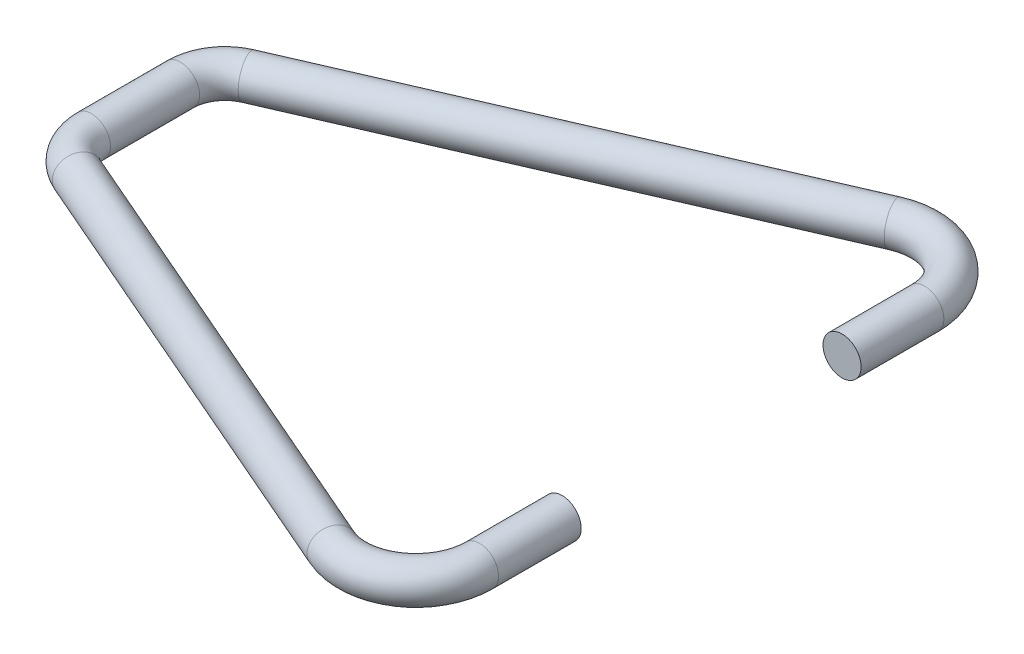
ISO-10303-21;
HEADER;
FILE_DESCRIPTION(('STEP AP214'),'2;1');
FILE_NAME('part.step','',(''),(''),'','','');
FILE_SCHEMA(('AUTOMOTIVE_DESIGN { 1 0 10303 214 1 1 1 1 }'));
ENDSEC;
DATA;
#1=APPLICATION_CONTEXT('core data for automotive mechanical design processes');
#2=APPLICATION_PROTOCOL_DEFINITION('international standard','automotive_design',2000,#1);
#3=PRODUCT_CONTEXT('',#1,'mechanical');
#4=PRODUCT('Part','Part','',(#3));
#5=PRODUCT_RELATED_PRODUCT_CATEGORY('part','',(#4));
#6=PRODUCT_DEFINITION_FORMATION('','',#4);
#7=PRODUCT_DEFINITION_CONTEXT('part definition',#1,'design');
#8=PRODUCT_DEFINITION('design','',#6,#7);
#9=PRODUCT_DEFINITION_SHAPE('','',#8);
#10=(LENGTH_UNIT() NAMED_UNIT(*) SI_UNIT(.MILLI.,.METRE.));
#11=(NAMED_UNIT(*) PLANE_ANGLE_UNIT() SI_UNIT($,.RADIAN.));
#12=(NAMED_UNIT(*) SI_UNIT($,.STERADIAN.) SOLID_ANGLE_UNIT());
#13=UNCERTAINTY_MEASURE_WITH_UNIT(LENGTH_MEASURE(1.E-05),#10,'distance_accuracy_value','');
#14=(GEOMETRIC_REPRESENTATION_CONTEXT(3) GLOBAL_UNCERTAINTY_ASSIGNED_CONTEXT((#13)) GLOBAL_UNIT_ASSIGNED_CONTEXT((#10,
#11,#12)) REPRESENTATION_CONTEXT('',''));
#15=CARTESIAN_POINT('',(0.,0.,0.));
#16=DIRECTION('',(0.,0.,1.));
#17=DIRECTION('',(1.,0.,0.));
#18=AXIS2_PLACEMENT_3D('',#15,#16,#17);
#19=CARTESIAN_POINT('',(89.,0.,-22.));
#20=DIRECTION('',(0.,0.,-1.));
#21=DIRECTION('',(-1.,0.,0.));
#22=AXIS2_PLACEMENT_3D('',#19,#20,#21);
#23=PLANE('',#22);
#24=CARTESIAN_POINT('',(89.,0.,-22.));
#25=DIRECTION('',(0.,0.,-1.));
#26=DIRECTION('',(-1.,0.,0.));
#27=AXIS2_PLACEMENT_3D('',#24,#25,#26);
#28=CIRCLE('',#27,3.);
#29=CARTESIAN_POINT('',(86.,0.,-22.));
#30=VERTEX_POINT('',#29);
#31=EDGE_CURVE('E10',#30,#30,#28,.T.);
#32=ORIENTED_EDGE('',*,*,#31,.F.);
#33=EDGE_LOOP('',(#32));
#34=FACE_BOUND('',#33,.T.);
#35=ADVANCED_FACE('F41',(#34),#23,.F.);
#36=CARTESIAN_POINT('',(0.,0.,0.));
#37=DIRECTION('',(0.,0.,-1.));
#38=DIRECTION('',(-1.,0.,0.));
#39=AXIS2_PLACEMENT_3D('',#36,#37,#38);
#40=CYLINDRICAL_SURFACE('',#39,3.);
#41=CARTESIAN_POINT('',(0.,0.,-7.));
#42=DIRECTION('',(0.,0.,1.));
#43=DIRECTION('',(1.,0.,0.));
#44=AXIS2_PLACEMENT_3D('',#41,#42,#43);
#45=CIRCLE('',#44,3.);
#46=CARTESIAN_POINT('',(-3.,0.,-7.));
#47=VERTEX_POINT('',#46);
#48=EDGE_CURVE('E64',#47,#47,#45,.T.);
#49=ORIENTED_EDGE('',*,*,#48,.T.);
#50=EDGE_LOOP('',(#49));
#51=FACE_BOUND('',#50,.T.);
#52=CARTESIAN_POINT('',(0.,0.,7.));
#53=DIRECTION('',(0.,0.,1.));
#54=DIRECTION('',(1.,0.,0.));
#55=AXIS2_PLACEMENT_3D('',#52,#53,#54);
#56=CIRCLE('',#55,3.);
#57=CARTESIAN_POINT('',(-3.,0.,7.));
#58=VERTEX_POINT('',#57);
#59=EDGE_CURVE('E84',#58,#58,#56,.F.);
#60=ORIENTED_EDGE('',*,*,#59,.T.);
#61=EDGE_LOOP('',(#60));
#62=FACE_BOUND('',#61,.T.);
#63=ADVANCED_FACE('F89',(#51,#62),#40,.T.);
#64=CARTESIAN_POINT('',(7.,0.,-7.));
#65=DIRECTION('',(0.,-1.,0.));
#66=DIRECTION('',(0.,0.,-1.));
#67=AXIS2_PLACEMENT_3D('',#64,#65,#66);
#68=TOROIDAL_SURFACE('',#67,7.,3.);
#69=CARTESIAN_POINT('',(4.21143873304606,0.,-13.4205861150244));
#70=DIRECTION('',(-0.91722658786063,0.,0.398365895279134));
#71=DIRECTION('',(0.398365895279134,0.,0.91722658786063));
#72=AXIS2_PLACEMENT_3D('',#69,#70,#71);
#73=CIRCLE('',#72,3.);
#74=CARTESIAN_POINT('',(3.01634104720865,0.,-16.1722658786063));
#75=VERTEX_POINT('',#74);
#76=EDGE_CURVE('E58',#75,#75,#73,.T.);
#77=CARTESIAN_POINT('',(7.,0.,-7.));
#78=DIRECTION('',(0.,-1.,0.));
#79=DIRECTION('',(0.,0.,-1.));
#80=AXIS2_PLACEMENT_3D('',#77,#78,#79);
#81=CIRCLE('',#80,10.);
#82=EDGE_CURVE('',#47,#75,#81,.T.);
#83=ORIENTED_EDGE('',*,*,#48,.F.);
#84=ORIENTED_EDGE('',*,*,#76,.T.);
#85=ORIENTED_EDGE('',*,*,#82,.T.);
#86=ORIENTED_EDGE('',*,*,#82,.F.);
#87=EDGE_LOOP('',(#83,#85,#84,#86));
#88=FACE_BOUND('',#87,.T.);
#89=ADVANCED_FACE('F118',(#88),#68,.T.);
#90=CARTESIAN_POINT('',(4.21143873304606,0.,-13.4205861150244));
#91=DIRECTION('',(0.91722658786063,0.,-0.398365895279134));
#92=DIRECTION('',(-0.398365895279134,0.,-0.91722658786063));
#93=AXIS2_PLACEMENT_3D('',#90,#91,#92);
#94=CYLINDRICAL_SURFACE('',#93,3.);
#95=CARTESIAN_POINT('',(75.0163410472087,0.,-44.1722658786063));
#96=DIRECTION('',(-0.91722658786063,0.,0.398365895279134));
#97=DIRECTION('',(0.398365895279134,0.,0.91722658786063));
#98=AXIS2_PLACEMENT_3D('',#95,#96,#97);
#99=CIRCLE('',#98,3.);
#100=CARTESIAN_POINT('',(73.8212433613712,0.,-46.9239456421882));
#101=VERTEX_POINT('',#100);
#102=EDGE_CURVE('E53',#101,#101,#99,.T.);
#103=ORIENTED_EDGE('',*,*,#102,.T.);
#104=EDGE_LOOP('',(#103));
#105=FACE_BOUND('',#104,.T.);
#106=ORIENTED_EDGE('',*,*,#76,.F.);
#107=EDGE_LOOP('',(#106));
#108=FACE_BOUND('',#107,.T.);
#109=ADVANCED_FACE('F112',(#105,#108),#94,.T.);
#110=CARTESIAN_POINT('',(79.,0.,-35.));
#111=DIRECTION('',(0.,-1.,0.));
#112=DIRECTION('',(0.,0.,-1.));
#113=AXIS2_PLACEMENT_3D('',#110,#111,#112);
#114=TOROIDAL_SURFACE('',#113,10.,3.);
#115=CARTESIAN_POINT('',(89.,0.,-35.));
#116=DIRECTION('',(0.,0.,-1.));
#117=DIRECTION('',(-1.,0.,0.));
#118=AXIS2_PLACEMENT_3D('',#115,#116,#117);
#119=CIRCLE('',#118,3.);
#120=CARTESIAN_POINT('',(92.,0.,-35.));
#121=VERTEX_POINT('',#120);
#122=EDGE_CURVE('E48',#121,#121,#119,.T.);
#123=CARTESIAN_POINT('',(79.,0.,-35.));
#124=DIRECTION('',(0.,-1.,0.));
#125=DIRECTION('',(0.,0.,-1.));
#126=AXIS2_PLACEMENT_3D('',#123,#124,#125);
#127=CIRCLE('',#126,13.);
#128=EDGE_CURVE('',#101,#121,#127,.T.);
#129=ORIENTED_EDGE('',*,*,#102,.F.);
#130=ORIENTED_EDGE('',*,*,#122,.T.);
#131=ORIENTED_EDGE('',*,*,#128,.T.);
#132=ORIENTED_EDGE('',*,*,#128,.F.);
#133=EDGE_LOOP('',(#129,#131,#130,#132));
#134=FACE_BOUND('',#133,.T.);
#135=ADVANCED_FACE('F108',(#134),#114,.T.);
#136=CARTESIAN_POINT('',(89.,0.,-35.));
#137=DIRECTION('',(0.,0.,1.));
#138=DIRECTION('',(1.,0.,0.));
#139=AXIS2_PLACEMENT_3D('',#136,#137,#138);
#140=CYLINDRICAL_SURFACE('',#139,3.);
#141=ORIENTED_EDGE('',*,*,#31,.T.);
#142=EDGE_LOOP('',(#141));
#143=FACE_BOUND('',#142,.T.);
#144=ORIENTED_EDGE('',*,*,#122,.F.);
#145=EDGE_LOOP('',(#144));
#146=FACE_BOUND('',#145,.T.);
#147=ADVANCED_FACE('F104',(#143,#146),#140,.T.);
#148=CARTESIAN_POINT('',(89.,0.,22.));
#149=DIRECTION('',(0.,0.,1.));
#150=DIRECTION('',(-1.,0.,0.));
#151=AXIS2_PLACEMENT_3D('',#148,#149,#150);
#152=PLANE('',#151);
#153=CARTESIAN_POINT('',(89.,0.,22.));
#154=DIRECTION('',(0.,0.,-1.));
#155=DIRECTION('',(-1.,0.,0.));
#156=AXIS2_PLACEMENT_3D('',#153,#154,#155);
#157=CIRCLE('',#156,3.);
#158=CARTESIAN_POINT('',(86.,0.,22.));
#159=VERTEX_POINT('',#158);
#160=EDGE_CURVE('E68',#159,#159,#157,.F.);
#161=ORIENTED_EDGE('',*,*,#160,.F.);
#162=EDGE_LOOP('',(#161));
#163=FACE_BOUND('',#162,.T.);
#164=ADVANCED_FACE('F94',(#163),#152,.F.);
#165=CARTESIAN_POINT('',(7.,0.,7.));
#166=DIRECTION('',(0.,1.,0.));
#167=DIRECTION('',(0.,0.,1.));
#168=AXIS2_PLACEMENT_3D('',#165,#166,#167);
#169=TOROIDAL_SURFACE('',#168,7.,3.);
#170=CARTESIAN_POINT('',(4.21143873304606,0.,13.4205861150244));
#171=DIRECTION('',(0.91722658786063,0.,0.398365895279134));
#172=DIRECTION('',(0.398365895279134,0.,-0.91722658786063));
#173=AXIS2_PLACEMENT_3D('',#170,#171,#172);
#174=CIRCLE('',#173,3.);
#175=CARTESIAN_POINT('',(3.01634104720865,0.,16.1722658786063));
#176=VERTEX_POINT('',#175);
#177=EDGE_CURVE('E80',#176,#176,#174,.F.);
#178=CARTESIAN_POINT('',(7.,0.,7.));
#179=DIRECTION('',(0.,1.,0.));
#180=DIRECTION('',(0.,0.,1.));
#181=AXIS2_PLACEMENT_3D('',#178,#179,#180);
#182=CIRCLE('',#181,10.);
#183=EDGE_CURVE('',#58,#176,#182,.T.);
#184=ORIENTED_EDGE('',*,*,#59,.F.);
#185=ORIENTED_EDGE('',*,*,#177,.T.);
#186=ORIENTED_EDGE('',*,*,#183,.T.);
#187=ORIENTED_EDGE('',*,*,#183,.F.);
#188=EDGE_LOOP('',(#184,#186,#185,#187));
#189=FACE_BOUND('',#188,.T.);
#190=ADVANCED_FACE('F91',(#189),#169,.T.);
#191=CARTESIAN_POINT('',(4.21143873304606,0.,13.4205861150244));
#192=DIRECTION('',(0.91722658786063,0.,0.398365895279134));
#193=DIRECTION('',(0.398365895279134,0.,-0.91722658786063));
#194=AXIS2_PLACEMENT_3D('',#191,#192,#193);
#195=CYLINDRICAL_SURFACE('',#194,3.);
#196=CARTESIAN_POINT('',(75.0163410472087,0.,44.1722658786063));
#197=DIRECTION('',(0.91722658786063,0.,0.398365895279134));
#198=DIRECTION('',(0.398365895279134,0.,-0.91722658786063));
#199=AXIS2_PLACEMENT_3D('',#196,#197,#198);
#200=CIRCLE('',#199,3.);
#201=CARTESIAN_POINT('',(73.8212433613712,0.,46.9239456421882));
#202=VERTEX_POINT('',#201);
#203=EDGE_CURVE('E76',#202,#202,#200,.F.);
#204=ORIENTED_EDGE('',*,*,#203,.T.);
#205=EDGE_LOOP('',(#204));
#206=FACE_BOUND('',#205,.T.);
#207=ORIENTED_EDGE('',*,*,#177,.F.);
#208=EDGE_LOOP('',(#207));
#209=FACE_BOUND('',#208,.T.);
#210=ADVANCED_FACE('F93',(#206,#209),#195,.T.);
#211=CARTESIAN_POINT('',(79.,0.,35.));
#212=DIRECTION('',(0.,1.,0.));
#213=DIRECTION('',(0.,0.,1.));
#214=AXIS2_PLACEMENT_3D('',#211,#212,#213);
#215=TOROIDAL_SURFACE('',#214,10.,3.);
#216=CARTESIAN_POINT('',(89.,0.,35.));
#217=DIRECTION('',(0.,0.,-1.));
#218=DIRECTION('',(-1.,0.,0.));
#219=AXIS2_PLACEMENT_3D('',#216,#217,#218);
#220=CIRCLE('',#219,3.);
#221=CARTESIAN_POINT('',(92.,0.,35.));
#222=VERTEX_POINT('',#221);
#223=EDGE_CURVE('E72',#222,#222,#220,.F.);
#224=CARTESIAN_POINT('',(79.,0.,35.));
#225=DIRECTION('',(0.,1.,0.));
#226=DIRECTION('',(0.,0.,1.));
#227=AXIS2_PLACEMENT_3D('',#224,#225,#226);
#228=CIRCLE('',#227,13.);
#229=EDGE_CURVE('',#202,#222,#228,.T.);
#230=ORIENTED_EDGE('',*,*,#203,.F.);
#231=ORIENTED_EDGE('',*,*,#223,.T.);
#232=ORIENTED_EDGE('',*,*,#229,.T.);
#233=ORIENTED_EDGE('',*,*,#229,.F.);
#234=EDGE_LOOP('',(#230,#232,#231,#233));
#235=FACE_BOUND('',#234,.T.);
#236=ADVANCED_FACE('F101',(#235),#215,.T.);
#237=CARTESIAN_POINT('',(89.,0.,35.));
#238=DIRECTION('',(0.,0.,-1.));
#239=DIRECTION('',(-1.,0.,0.));
#240=AXIS2_PLACEMENT_3D('',#237,#238,#239);
#241=CYLINDRICAL_SURFACE('',#240,3.);
#242=ORIENTED_EDGE('',*,*,#160,.T.);
#243=EDGE_LOOP('',(#242));
#244=FACE_BOUND('',#243,.T.);
#245=ORIENTED_EDGE('',*,*,#223,.F.);
#246=EDGE_LOOP('',(#245));
#247=FACE_BOUND('',#246,.T.);
#248=ADVANCED_FACE('F126',(#244,#247),#241,.T.);
#249=CLOSED_SHELL('',(#35,#63,#89,#109,#135,#147,#164,#190,#210,#236,#248));
#250=MANIFOLD_SOLID_BREP('B2',#249);
#251=ADVANCED_BREP_SHAPE_REPRESENTATION('',(#18,#250),#14);
#252=SHAPE_DEFINITION_REPRESENTATION(#9,#251);
ENDSEC;
END-ISO-10303-21;
